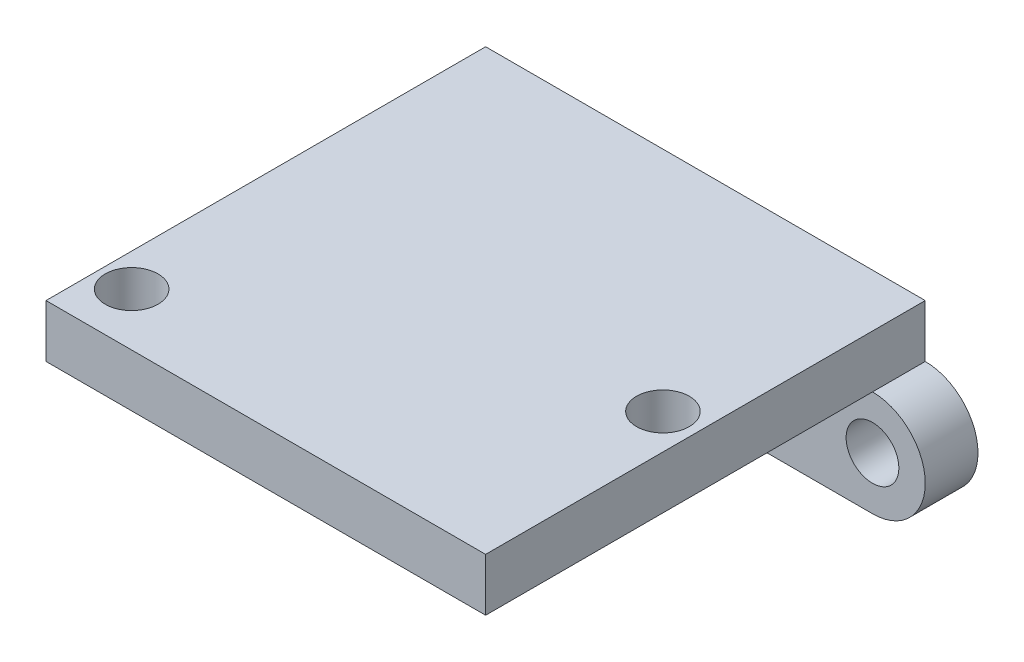
ISO-10303-21;
HEADER;
FILE_DESCRIPTION(('STEP AP214'),'2;1');
FILE_NAME('part.step','',(''),(''),'','','');
FILE_SCHEMA(('AUTOMOTIVE_DESIGN { 1 0 10303 214 1 1 1 1 }'));
ENDSEC;
DATA;
#1=APPLICATION_CONTEXT('core data for automotive mechanical design processes');
#2=APPLICATION_PROTOCOL_DEFINITION('international standard','automotive_design',2000,#1);
#3=PRODUCT_CONTEXT('',#1,'mechanical');
#4=PRODUCT('Part','Part','',(#3));
#5=PRODUCT_RELATED_PRODUCT_CATEGORY('part','',(#4));
#6=PRODUCT_DEFINITION_FORMATION('','',#4);
#7=PRODUCT_DEFINITION_CONTEXT('part definition',#1,'design');
#8=PRODUCT_DEFINITION('design','',#6,#7);
#9=PRODUCT_DEFINITION_SHAPE('','',#8);
#10=(LENGTH_UNIT() NAMED_UNIT(*) SI_UNIT(.MILLI.,.METRE.));
#11=(NAMED_UNIT(*) PLANE_ANGLE_UNIT() SI_UNIT($,.RADIAN.));
#12=(NAMED_UNIT(*) SI_UNIT($,.STERADIAN.) SOLID_ANGLE_UNIT());
#13=UNCERTAINTY_MEASURE_WITH_UNIT(LENGTH_MEASURE(1.E-05),#10,'distance_accuracy_value','');
#14=(GEOMETRIC_REPRESENTATION_CONTEXT(3) GLOBAL_UNCERTAINTY_ASSIGNED_CONTEXT((#13)) GLOBAL_UNIT_ASSIGNED_CONTEXT((#10,
#11,#12)) REPRESENTATION_CONTEXT('',''));
#15=CARTESIAN_POINT('',(0.,0.,0.));
#16=DIRECTION('',(0.,0.,1.));
#17=DIRECTION('',(1.,0.,0.));
#18=AXIS2_PLACEMENT_3D('',#15,#16,#17);
#19=CARTESIAN_POINT('',(0.,-3.,3.));
#20=DIRECTION('',(0.,-1.,0.));
#21=DIRECTION('',(1.,0.,0.));
#22=AXIS2_PLACEMENT_3D('',#19,#20,#21);
#23=PLANE('',#22);
#24=DIRECTION('',(-1.,0.,0.));
#25=VECTOR('',#24,1.);
#26=CARTESIAN_POINT('',(0.,-3.,0.));
#27=LINE('',#26,#25);
#28=CARTESIAN_POINT('',(12.5,-2.99999999999991,0.));
#29=VERTEX_POINT('',#28);
#30=CARTESIAN_POINT('',(-12.5,-3.00000000000009,0.));
#31=VERTEX_POINT('',#30);
#32=EDGE_CURVE('E130',#29,#31,#27,.T.);
#33=ORIENTED_EDGE('',*,*,#32,.F.);
#34=DIRECTION('',(0.,0.,-1.));
#35=VECTOR('',#34,1.);
#36=CARTESIAN_POINT('',(12.5,-2.99999999999991,3.));
#37=LINE('',#36,#35);
#38=CARTESIAN_POINT('',(12.5,-2.99999999999991,3.));
#39=VERTEX_POINT('',#38);
#40=EDGE_CURVE('E11',#39,#29,#37,.T.);
#41=ORIENTED_EDGE('',*,*,#40,.F.);
#42=DIRECTION('',(-1.,0.,0.));
#43=VECTOR('',#42,1.);
#44=CARTESIAN_POINT('',(0.,-3.,3.));
#45=LINE('',#44,#43);
#46=CARTESIAN_POINT('',(-12.5,-3.00000000000009,3.));
#47=VERTEX_POINT('',#46);
#48=EDGE_CURVE('E138',#39,#47,#45,.T.);
#49=ORIENTED_EDGE('',*,*,#48,.T.);
#50=DIRECTION('',(0.,0.,-1.));
#51=VECTOR('',#50,1.);
#52=CARTESIAN_POINT('',(-12.5,-3.00000000000009,3.));
#53=LINE('',#52,#51);
#54=EDGE_CURVE('E77',#47,#31,#53,.T.);
#55=ORIENTED_EDGE('',*,*,#54,.T.);
#56=EDGE_LOOP('',(#33,#41,#49,#55));
#57=FACE_BOUND('',#56,.T.);
#58=ADVANCED_FACE('F41',(#57),#23,.T.);
#59=CARTESIAN_POINT('',(12.5,0.,3.));
#60=DIRECTION('',(0.,0.,-1.));
#61=DIRECTION('',(-1.,0.,0.));
#62=AXIS2_PLACEMENT_3D('',#59,#60,#61);
#63=CYLINDRICAL_SURFACE('',#62,3.);
#64=CARTESIAN_POINT('',(12.5,0.,0.));
#65=DIRECTION('',(0.,0.,1.));
#66=DIRECTION('',(1.,0.,0.));
#67=AXIS2_PLACEMENT_3D('',#64,#65,#66);
#68=CIRCLE('',#67,3.);
#69=CARTESIAN_POINT('',(12.5,3.00000000000009,0.));
#70=VERTEX_POINT('',#69);
#71=EDGE_CURVE('E70',#29,#70,#68,.T.);
#72=ORIENTED_EDGE('',*,*,#71,.T.);
#73=DIRECTION('',(0.,0.,-1.));
#74=VECTOR('',#73,1.);
#75=CARTESIAN_POINT('',(12.5,3.00000000000009,3.));
#76=LINE('',#75,#74);
#77=CARTESIAN_POINT('',(12.5,3.00000000000009,3.));
#78=VERTEX_POINT('',#77);
#79=EDGE_CURVE('E49',#78,#70,#76,.T.);
#80=ORIENTED_EDGE('',*,*,#79,.F.);
#81=CARTESIAN_POINT('',(12.5,0.,3.));
#82=DIRECTION('',(0.,0.,1.));
#83=DIRECTION('',(1.,0.,0.));
#84=AXIS2_PLACEMENT_3D('',#81,#82,#83);
#85=CIRCLE('',#84,3.);
#86=EDGE_CURVE('E140',#39,#78,#85,.T.);
#87=ORIENTED_EDGE('',*,*,#86,.F.);
#88=ORIENTED_EDGE('',*,*,#40,.T.);
#89=EDGE_LOOP('',(#72,#80,#87,#88));
#90=FACE_BOUND('',#89,.T.);
#91=ADVANCED_FACE('F192',(#90),#63,.T.);
#92=CARTESIAN_POINT('',(-12.5,0.,3.));
#93=DIRECTION('',(0.,0.,-1.));
#94=DIRECTION('',(-1.,0.,0.));
#95=AXIS2_PLACEMENT_3D('',#92,#93,#94);
#96=CYLINDRICAL_SURFACE('',#95,1.5);
#97=CARTESIAN_POINT('',(-12.5,0.,3.));
#98=DIRECTION('',(0.,0.,1.));
#99=DIRECTION('',(1.,0.,0.));
#100=AXIS2_PLACEMENT_3D('',#97,#98,#99);
#101=CIRCLE('',#100,1.5);
#102=CARTESIAN_POINT('',(-11.,0.,3.));
#103=VERTEX_POINT('',#102);
#104=EDGE_CURVE('E145',#103,#103,#101,.T.);
#105=ORIENTED_EDGE('',*,*,#104,.T.);
#106=EDGE_LOOP('',(#105));
#107=FACE_BOUND('',#106,.T.);
#108=CARTESIAN_POINT('',(-12.5,0.,0.));
#109=DIRECTION('',(0.,0.,1.));
#110=DIRECTION('',(1.,0.,0.));
#111=AXIS2_PLACEMENT_3D('',#108,#109,#110);
#112=CIRCLE('',#111,1.5);
#113=CARTESIAN_POINT('',(-11.,0.,0.));
#114=VERTEX_POINT('',#113);
#115=EDGE_CURVE('E154',#114,#114,#112,.T.);
#116=ORIENTED_EDGE('',*,*,#115,.F.);
#117=EDGE_LOOP('',(#116));
#118=FACE_BOUND('',#117,.T.);
#119=ADVANCED_FACE('F194',(#107,#118),#96,.F.);
#120=CARTESIAN_POINT('',(-12.5,0.,3.));
#121=DIRECTION('',(0.,0.,-1.));
#122=DIRECTION('',(-1.,0.,0.));
#123=AXIS2_PLACEMENT_3D('',#120,#121,#122);
#124=CYLINDRICAL_SURFACE('',#123,3.);
#125=CARTESIAN_POINT('',(-12.5,0.,0.));
#126=DIRECTION('',(0.,0.,1.));
#127=DIRECTION('',(1.,0.,0.));
#128=AXIS2_PLACEMENT_3D('',#125,#126,#127);
#129=CIRCLE('',#128,3.);
#130=CARTESIAN_POINT('',(-12.5,3.00000000000009,0.));
#131=VERTEX_POINT('',#130);
#132=EDGE_CURVE('E152',#131,#31,#129,.T.);
#133=ORIENTED_EDGE('',*,*,#132,.T.);
#134=ORIENTED_EDGE('',*,*,#54,.F.);
#135=CARTESIAN_POINT('',(-12.5,0.,3.));
#136=DIRECTION('',(0.,0.,1.));
#137=DIRECTION('',(1.,0.,0.));
#138=AXIS2_PLACEMENT_3D('',#135,#136,#137);
#139=CIRCLE('',#138,3.);
#140=CARTESIAN_POINT('',(-12.5,2.99999999999991,3.));
#141=VERTEX_POINT('',#140);
#142=EDGE_CURVE('E57',#141,#47,#139,.T.);
#143=ORIENTED_EDGE('',*,*,#142,.F.);
#144=DIRECTION('',(0.,0.,-1.));
#145=VECTOR('',#144,1.);
#146=CARTESIAN_POINT('',(-12.5,2.99999999999991,3.));
#147=LINE('',#146,#145);
#148=EDGE_CURVE('E160',#141,#131,#147,.T.);
#149=ORIENTED_EDGE('',*,*,#148,.T.);
#150=EDGE_LOOP('',(#133,#134,#143,#149));
#151=FACE_BOUND('',#150,.T.);
#152=ADVANCED_FACE('F189',(#151),#124,.T.);
#153=CARTESIAN_POINT('',(12.5,0.,3.));
#154=DIRECTION('',(0.,0.,-1.));
#155=DIRECTION('',(-1.,0.,0.));
#156=AXIS2_PLACEMENT_3D('',#153,#154,#155);
#157=CYLINDRICAL_SURFACE('',#156,1.5);
#158=CARTESIAN_POINT('',(12.5,0.,3.));
#159=DIRECTION('',(0.,0.,1.));
#160=DIRECTION('',(1.,0.,0.));
#161=AXIS2_PLACEMENT_3D('',#158,#159,#160);
#162=CIRCLE('',#161,1.5);
#163=CARTESIAN_POINT('',(14.,0.,3.));
#164=VERTEX_POINT('',#163);
#165=EDGE_CURVE('E148',#164,#164,#162,.T.);
#166=ORIENTED_EDGE('',*,*,#165,.T.);
#167=EDGE_LOOP('',(#166));
#168=FACE_BOUND('',#167,.T.);
#169=CARTESIAN_POINT('',(12.5,0.,0.));
#170=DIRECTION('',(0.,0.,1.));
#171=DIRECTION('',(1.,0.,0.));
#172=AXIS2_PLACEMENT_3D('',#169,#170,#171);
#173=CIRCLE('',#172,1.5);
#174=CARTESIAN_POINT('',(14.,0.,0.));
#175=VERTEX_POINT('',#174);
#176=EDGE_CURVE('E141',#175,#175,#173,.T.);
#177=ORIENTED_EDGE('',*,*,#176,.F.);
#178=EDGE_LOOP('',(#177));
#179=FACE_BOUND('',#178,.T.);
#180=ADVANCED_FACE('F203',(#168,#179),#157,.F.);
#181=CARTESIAN_POINT('',(0.,0.,3.));
#182=DIRECTION('',(0.,0.,1.));
#183=DIRECTION('',(1.,0.,0.));
#184=AXIS2_PLACEMENT_3D('',#181,#182,#183);
#185=PLANE('',#184);
#186=ORIENTED_EDGE('',*,*,#48,.F.);
#187=ORIENTED_EDGE('',*,*,#86,.T.);
#188=DIRECTION('',(-1.,0.,0.));
#189=VECTOR('',#188,1.);
#190=CARTESIAN_POINT('',(0.,3.,3.));
#191=LINE('',#190,#189);
#192=EDGE_CURVE('E129',#78,#141,#191,.T.);
#193=ORIENTED_EDGE('',*,*,#192,.T.);
#194=ORIENTED_EDGE('',*,*,#142,.T.);
#195=EDGE_LOOP('',(#186,#187,#193,#194));
#196=FACE_BOUND('',#195,.T.);
#197=ORIENTED_EDGE('',*,*,#104,.F.);
#198=EDGE_LOOP('',(#197));
#199=FACE_BOUND('',#198,.T.);
#200=ORIENTED_EDGE('',*,*,#165,.F.);
#201=EDGE_LOOP('',(#200));
#202=FACE_BOUND('',#201,.T.);
#203=ADVANCED_FACE('F190',(#196,#199,#202),#185,.T.);
#204=CARTESIAN_POINT('',(0.,0.,0.));
#205=DIRECTION('',(0.,0.,1.));
#206=DIRECTION('',(1.,0.,0.));
#207=AXIS2_PLACEMENT_3D('',#204,#205,#206);
#208=PLANE('',#207);
#209=ORIENTED_EDGE('',*,*,#32,.T.);
#210=ORIENTED_EDGE('',*,*,#132,.F.);
#211=DIRECTION('',(0.,-1.,0.));
#212=VECTOR('',#211,1.);
#213=CARTESIAN_POINT('',(-12.5,0.,0.));
#214=LINE('',#213,#212);
#215=CARTESIAN_POINT('',(-12.5,6.00000000000009,0.));
#216=VERTEX_POINT('',#215);
#217=EDGE_CURVE('E125',#216,#131,#214,.T.);
#218=ORIENTED_EDGE('',*,*,#217,.F.);
#219=DIRECTION('',(-1.,0.,0.));
#220=VECTOR('',#219,1.);
#221=CARTESIAN_POINT('',(0.,6.00000000000009,0.));
#222=LINE('',#221,#220);
#223=CARTESIAN_POINT('',(12.5,6.00000000000009,0.));
#224=VERTEX_POINT('',#223);
#225=EDGE_CURVE('E169',#224,#216,#222,.T.);
#226=ORIENTED_EDGE('',*,*,#225,.F.);
#227=DIRECTION('',(0.,1.,0.));
#228=VECTOR('',#227,1.);
#229=CARTESIAN_POINT('',(12.5,0.,0.));
#230=LINE('',#229,#228);
#231=EDGE_CURVE('E163',#70,#224,#230,.T.);
#232=ORIENTED_EDGE('',*,*,#231,.F.);
#233=ORIENTED_EDGE('',*,*,#71,.F.);
#234=EDGE_LOOP('',(#209,#210,#218,#226,#232,#233));
#235=FACE_BOUND('',#234,.T.);
#236=ORIENTED_EDGE('',*,*,#115,.T.);
#237=EDGE_LOOP('',(#236));
#238=FACE_BOUND('',#237,.T.);
#239=ORIENTED_EDGE('',*,*,#176,.T.);
#240=EDGE_LOOP('',(#239));
#241=FACE_BOUND('',#240,.T.);
#242=ADVANCED_FACE('F166',(#235,#238,#241),#208,.F.);
#243=CARTESIAN_POINT('',(0.,3.00000000000009,25.));
#244=DIRECTION('',(0.,1.,0.));
#245=DIRECTION('',(0.,0.,1.));
#246=AXIS2_PLACEMENT_3D('',#243,#244,#245);
#247=PLANE('',#246);
#248=CARTESIAN_POINT('',(10.502499810032,3.00000000000009,12.9201506478237));
#249=DIRECTION('',(0.,-1.,0.));
#250=DIRECTION('',(0.,0.,-1.));
#251=AXIS2_PLACEMENT_3D('',#248,#249,#250);
#252=CIRCLE('',#251,1.5);
#253=CARTESIAN_POINT('',(10.502499810032,3.00000000000009,11.4201506478237));
#254=VERTEX_POINT('',#253);
#255=EDGE_CURVE('E174',#254,#254,#252,.T.);
#256=ORIENTED_EDGE('',*,*,#255,.F.);
#257=EDGE_LOOP('',(#256));
#258=FACE_BOUND('',#257,.T.);
#259=CARTESIAN_POINT('',(-10.6293797973711,3.00000000000009,22.));
#260=DIRECTION('',(0.,-1.,0.));
#261=DIRECTION('',(0.,0.,-1.));
#262=AXIS2_PLACEMENT_3D('',#259,#260,#261);
#263=CIRCLE('',#262,1.5);
#264=CARTESIAN_POINT('',(-10.6293797973711,3.00000000000009,20.5));
#265=VERTEX_POINT('',#264);
#266=EDGE_CURVE('E238',#265,#265,#263,.T.);
#267=ORIENTED_EDGE('',*,*,#266,.F.);
#268=EDGE_LOOP('',(#267));
#269=FACE_BOUND('',#268,.T.);
#270=ORIENTED_EDGE('',*,*,#192,.F.);
#271=DIRECTION('',(0.,0.,-1.));
#272=VECTOR('',#271,1.);
#273=CARTESIAN_POINT('',(12.5,3.00000000000009,25.));
#274=LINE('',#273,#272);
#275=CARTESIAN_POINT('',(12.5,3.00000000000009,25.));
#276=VERTEX_POINT('',#275);
#277=EDGE_CURVE('E110',#276,#78,#274,.T.);
#278=ORIENTED_EDGE('',*,*,#277,.F.);
#279=DIRECTION('',(1.,0.,0.));
#280=VECTOR('',#279,1.);
#281=CARTESIAN_POINT('',(0.,3.00000000000009,25.));
#282=LINE('',#281,#280);
#283=CARTESIAN_POINT('',(-12.5,3.00000000000009,25.));
#284=VERTEX_POINT('',#283);
#285=EDGE_CURVE('E116',#284,#276,#282,.T.);
#286=ORIENTED_EDGE('',*,*,#285,.F.);
#287=DIRECTION('',(0.,0.,-1.));
#288=VECTOR('',#287,1.);
#289=CARTESIAN_POINT('',(-12.5,3.00000000000009,25.));
#290=LINE('',#289,#288);
#291=EDGE_CURVE('E181',#284,#141,#290,.T.);
#292=ORIENTED_EDGE('',*,*,#291,.T.);
#293=EDGE_LOOP('',(#270,#278,#286,#292));
#294=FACE_BOUND('',#293,.T.);
#295=ADVANCED_FACE('F128',(#258,#269,#294),#247,.F.);
#296=CARTESIAN_POINT('',(12.5,0.,25.));
#297=DIRECTION('',(-1.,0.,0.));
#298=DIRECTION('',(0.,0.,1.));
#299=AXIS2_PLACEMENT_3D('',#296,#297,#298);
#300=PLANE('',#299);
#301=ORIENTED_EDGE('',*,*,#231,.T.);
#302=DIRECTION('',(0.,0.,-1.));
#303=VECTOR('',#302,1.);
#304=CARTESIAN_POINT('',(12.5,6.00000000000009,25.));
#305=LINE('',#304,#303);
#306=CARTESIAN_POINT('',(12.5,6.00000000000009,25.));
#307=VERTEX_POINT('',#306);
#308=EDGE_CURVE('E112',#307,#224,#305,.T.);
#309=ORIENTED_EDGE('',*,*,#308,.F.);
#310=DIRECTION('',(0.,1.,0.));
#311=VECTOR('',#310,1.);
#312=CARTESIAN_POINT('',(12.5,0.,25.));
#313=LINE('',#312,#311);
#314=EDGE_CURVE('E106',#276,#307,#313,.T.);
#315=ORIENTED_EDGE('',*,*,#314,.F.);
#316=ORIENTED_EDGE('',*,*,#277,.T.);
#317=ORIENTED_EDGE('',*,*,#79,.T.);
#318=EDGE_LOOP('',(#301,#309,#315,#316,#317));
#319=FACE_BOUND('',#318,.T.);
#320=ADVANCED_FACE('F108',(#319),#300,.F.);
#321=CARTESIAN_POINT('',(0.,6.00000000000009,25.));
#322=DIRECTION('',(0.,-1.,0.));
#323=DIRECTION('',(0.,0.,-1.));
#324=AXIS2_PLACEMENT_3D('',#321,#322,#323);
#325=PLANE('',#324);
#326=CARTESIAN_POINT('',(10.502499810032,6.00000000000009,12.9201506478237));
#327=DIRECTION('',(0.,-1.,0.));
#328=DIRECTION('',(0.,0.,-1.));
#329=AXIS2_PLACEMENT_3D('',#326,#327,#328);
#330=CIRCLE('',#329,1.5);
#331=CARTESIAN_POINT('',(10.502499810032,6.00000000000009,11.4201506478237));
#332=VERTEX_POINT('',#331);
#333=EDGE_CURVE('E170',#332,#332,#330,.T.);
#334=ORIENTED_EDGE('',*,*,#333,.T.);
#335=EDGE_LOOP('',(#334));
#336=FACE_BOUND('',#335,.T.);
#337=CARTESIAN_POINT('',(-10.6293797973711,6.00000000000009,22.));
#338=DIRECTION('',(0.,-1.,0.));
#339=DIRECTION('',(0.,0.,-1.));
#340=AXIS2_PLACEMENT_3D('',#337,#338,#339);
#341=CIRCLE('',#340,1.5);
#342=CARTESIAN_POINT('',(-10.6293797973711,6.00000000000009,20.5));
#343=VERTEX_POINT('',#342);
#344=EDGE_CURVE('E241',#343,#343,#341,.T.);
#345=ORIENTED_EDGE('',*,*,#344,.T.);
#346=EDGE_LOOP('',(#345));
#347=FACE_BOUND('',#346,.T.);
#348=ORIENTED_EDGE('',*,*,#225,.T.);
#349=DIRECTION('',(0.,0.,-1.));
#350=VECTOR('',#349,1.);
#351=CARTESIAN_POINT('',(-12.5,6.00000000000009,25.));
#352=LINE('',#351,#350);
#353=CARTESIAN_POINT('',(-12.5,6.00000000000009,25.));
#354=VERTEX_POINT('',#353);
#355=EDGE_CURVE('E134',#354,#216,#352,.T.);
#356=ORIENTED_EDGE('',*,*,#355,.F.);
#357=DIRECTION('',(-1.,0.,0.));
#358=VECTOR('',#357,1.);
#359=CARTESIAN_POINT('',(0.,6.00000000000009,25.));
#360=LINE('',#359,#358);
#361=EDGE_CURVE('E115',#307,#354,#360,.T.);
#362=ORIENTED_EDGE('',*,*,#361,.F.);
#363=ORIENTED_EDGE('',*,*,#308,.T.);
#364=EDGE_LOOP('',(#348,#356,#362,#363));
#365=FACE_BOUND('',#364,.T.);
#366=ADVANCED_FACE('F217',(#336,#347,#365),#325,.F.);
#367=CARTESIAN_POINT('',(-12.5,0.,25.));
#368=DIRECTION('',(1.,0.,0.));
#369=DIRECTION('',(0.,0.,-1.));
#370=AXIS2_PLACEMENT_3D('',#367,#368,#369);
#371=PLANE('',#370);
#372=ORIENTED_EDGE('',*,*,#217,.T.);
#373=ORIENTED_EDGE('',*,*,#148,.F.);
#374=ORIENTED_EDGE('',*,*,#291,.F.);
#375=DIRECTION('',(0.,-1.,0.));
#376=VECTOR('',#375,1.);
#377=CARTESIAN_POINT('',(-12.5,0.,25.));
#378=LINE('',#377,#376);
#379=EDGE_CURVE('E121',#354,#284,#378,.T.);
#380=ORIENTED_EDGE('',*,*,#379,.F.);
#381=ORIENTED_EDGE('',*,*,#355,.T.);
#382=EDGE_LOOP('',(#372,#373,#374,#380,#381));
#383=FACE_BOUND('',#382,.T.);
#384=ADVANCED_FACE('F185',(#383),#371,.F.);
#385=CARTESIAN_POINT('',(0.,0.,25.));
#386=DIRECTION('',(0.,0.,1.));
#387=DIRECTION('',(1.,0.,0.));
#388=AXIS2_PLACEMENT_3D('',#385,#386,#387);
#389=PLANE('',#388);
#390=ORIENTED_EDGE('',*,*,#285,.T.);
#391=ORIENTED_EDGE('',*,*,#314,.T.);
#392=ORIENTED_EDGE('',*,*,#361,.T.);
#393=ORIENTED_EDGE('',*,*,#379,.T.);
#394=EDGE_LOOP('',(#390,#391,#392,#393));
#395=FACE_BOUND('',#394,.T.);
#396=ADVANCED_FACE('F119',(#395),#389,.T.);
#397=CARTESIAN_POINT('',(-10.6293797973711,6.00000000000009,22.));
#398=DIRECTION('',(0.,-1.,0.));
#399=DIRECTION('',(0.,0.,-1.));
#400=AXIS2_PLACEMENT_3D('',#397,#398,#399);
#401=CYLINDRICAL_SURFACE('',#400,1.5);
#402=ORIENTED_EDGE('',*,*,#344,.F.);
#403=EDGE_LOOP('',(#402));
#404=FACE_BOUND('',#403,.T.);
#405=ORIENTED_EDGE('',*,*,#266,.T.);
#406=EDGE_LOOP('',(#405));
#407=FACE_BOUND('',#406,.T.);
#408=ADVANCED_FACE('F225',(#404,#407),#401,.F.);
#409=CARTESIAN_POINT('',(10.502499810032,6.00000000000009,12.9201506478237));
#410=DIRECTION('',(0.,-1.,0.));
#411=DIRECTION('',(0.,0.,-1.));
#412=AXIS2_PLACEMENT_3D('',#409,#410,#411);
#413=CYLINDRICAL_SURFACE('',#412,1.5);
#414=ORIENTED_EDGE('',*,*,#333,.F.);
#415=EDGE_LOOP('',(#414));
#416=FACE_BOUND('',#415,.T.);
#417=ORIENTED_EDGE('',*,*,#255,.T.);
#418=EDGE_LOOP('',(#417));
#419=FACE_BOUND('',#418,.T.);
#420=ADVANCED_FACE('F228',(#416,#419),#413,.F.);
#421=CLOSED_SHELL('',(#58,#91,#119,#152,#180,#203,#242,#295,#320,#366,#384,#396,#408,#420));
#422=MANIFOLD_SOLID_BREP('B2',#421);
#423=ADVANCED_BREP_SHAPE_REPRESENTATION('',(#18,#422),#14);
#424=SHAPE_DEFINITION_REPRESENTATION(#9,#423);
ENDSEC;
END-ISO-10303-21;
